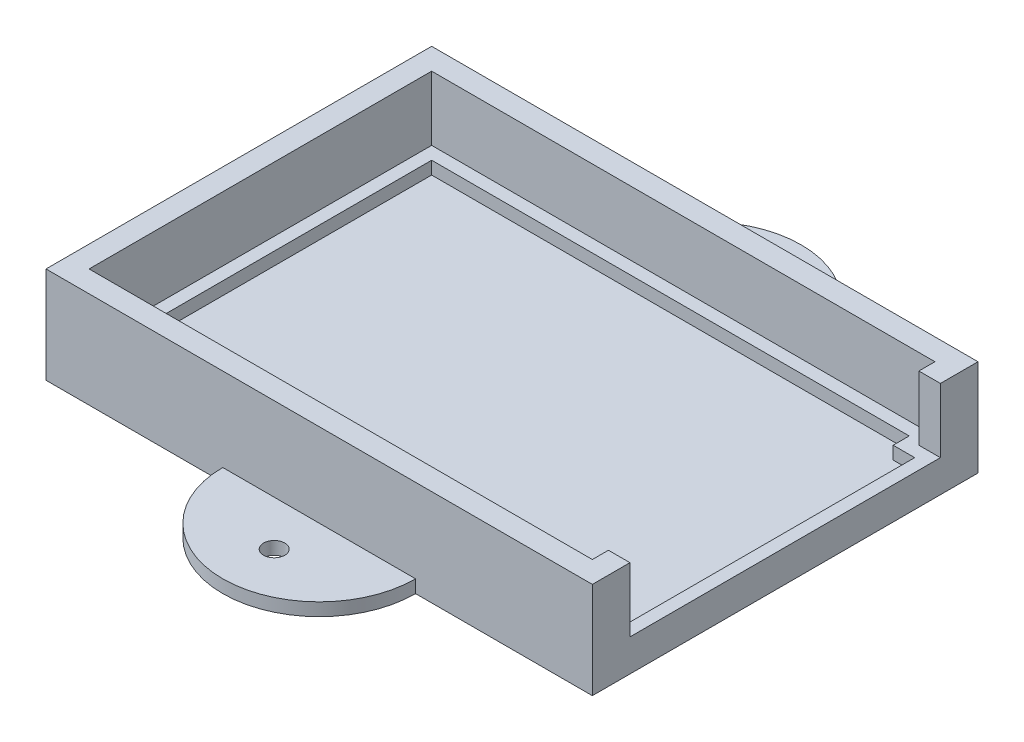
ISO-10303-21;
HEADER;
FILE_DESCRIPTION(('STEP AP214'),'2;1');
FILE_NAME('part.step','',(''),(''),'','','');
FILE_SCHEMA(('AUTOMOTIVE_DESIGN { 1 0 10303 214 1 1 1 1 }'));
ENDSEC;
DATA;
#1=APPLICATION_CONTEXT('core data for automotive mechanical design processes');
#2=APPLICATION_PROTOCOL_DEFINITION('international standard','automotive_design',2000,#1);
#3=PRODUCT_CONTEXT('',#1,'mechanical');
#4=PRODUCT('Part','Part','',(#3));
#5=PRODUCT_RELATED_PRODUCT_CATEGORY('part','',(#4));
#6=PRODUCT_DEFINITION_FORMATION('','',#4);
#7=PRODUCT_DEFINITION_CONTEXT('part definition',#1,'design');
#8=PRODUCT_DEFINITION('design','',#6,#7);
#9=PRODUCT_DEFINITION_SHAPE('','',#8);
#10=(LENGTH_UNIT() NAMED_UNIT(*) SI_UNIT(.MILLI.,.METRE.));
#11=(NAMED_UNIT(*) PLANE_ANGLE_UNIT() SI_UNIT($,.RADIAN.));
#12=(NAMED_UNIT(*) SI_UNIT($,.STERADIAN.) SOLID_ANGLE_UNIT());
#13=UNCERTAINTY_MEASURE_WITH_UNIT(LENGTH_MEASURE(1.E-05),#10,'distance_accuracy_value','');
#14=(GEOMETRIC_REPRESENTATION_CONTEXT(3) GLOBAL_UNCERTAINTY_ASSIGNED_CONTEXT((#13)) GLOBAL_UNIT_ASSIGNED_CONTEXT((#10,
#11,#12)) REPRESENTATION_CONTEXT('',''));
#15=CARTESIAN_POINT('',(0.,0.,0.));
#16=DIRECTION('',(0.,0.,1.));
#17=DIRECTION('',(1.,0.,0.));
#18=AXIS2_PLACEMENT_3D('',#15,#16,#17);
#19=CARTESIAN_POINT('',(39.15,15.,26.65));
#20=DIRECTION('',(-1.,0.,0.));
#21=DIRECTION('',(0.,0.,1.));
#22=AXIS2_PLACEMENT_3D('',#19,#20,#21);
#23=PLANE('',#22);
#24=DIRECTION('',(0.,0.,-1.));
#25=VECTOR('',#24,1.);
#26=CARTESIAN_POINT('',(39.15,5.,-24.15));
#27=LINE('',#26,#25);
#28=CARTESIAN_POINT('',(39.15,5.,-24.15));
#29=VERTEX_POINT('',#28);
#30=CARTESIAN_POINT('',(39.15,5.,-26.65));
#31=VERTEX_POINT('',#30);
#32=EDGE_CURVE('E304',#29,#31,#27,.T.);
#33=ORIENTED_EDGE('',*,*,#32,.F.);
#34=DIRECTION('',(0.,1.,0.));
#35=VECTOR('',#34,1.);
#36=CARTESIAN_POINT('',(39.15,-45.4160355667417,-24.15));
#37=LINE('',#36,#35);
#38=CARTESIAN_POINT('',(39.15,15.,-24.15));
#39=VERTEX_POINT('',#38);
#40=EDGE_CURVE('E317',#29,#39,#37,.T.);
#41=ORIENTED_EDGE('',*,*,#40,.T.);
#42=DIRECTION('',(0.,0.,-1.));
#43=VECTOR('',#42,1.);
#44=CARTESIAN_POINT('',(39.15,15.,26.65));
#45=LINE('',#44,#43);
#46=CARTESIAN_POINT('',(39.15,15.,-26.65));
#47=VERTEX_POINT('',#46);
#48=EDGE_CURVE('E319',#39,#47,#45,.T.);
#49=ORIENTED_EDGE('',*,*,#48,.T.);
#50=DIRECTION('',(0.,-1.,0.));
#51=VECTOR('',#50,1.);
#52=CARTESIAN_POINT('',(39.15,15.,-26.65));
#53=LINE('',#52,#51);
#54=EDGE_CURVE('E344',#47,#31,#53,.T.);
#55=ORIENTED_EDGE('',*,*,#54,.T.);
#56=EDGE_LOOP('',(#33,#41,#49,#55));
#57=FACE_BOUND('',#56,.T.);
#58=ADVANCED_FACE('F39',(#57),#23,.T.);
#59=CARTESIAN_POINT('',(-42.5,15.,30.));
#60=DIRECTION('',(1.,0.,0.));
#61=DIRECTION('',(0.,0.,-1.));
#62=AXIS2_PLACEMENT_3D('',#59,#60,#61);
#63=PLANE('',#62);
#64=DIRECTION('',(0.,0.,1.));
#65=VECTOR('',#64,1.);
#66=CARTESIAN_POINT('',(-42.5,0.,30.));
#67=LINE('',#66,#65);
#68=CARTESIAN_POINT('',(-42.5,0.,-30.));
#69=VERTEX_POINT('',#68);
#70=CARTESIAN_POINT('',(-42.5,0.,30.));
#71=VERTEX_POINT('',#70);
#72=EDGE_CURVE('E208',#69,#71,#67,.T.);
#73=ORIENTED_EDGE('',*,*,#72,.T.);
#74=DIRECTION('',(0.,-1.,0.));
#75=VECTOR('',#74,1.);
#76=CARTESIAN_POINT('',(-42.5,15.,30.));
#77=LINE('',#76,#75);
#78=CARTESIAN_POINT('',(-42.5,15.,30.));
#79=VERTEX_POINT('',#78);
#80=EDGE_CURVE('E47',#79,#71,#77,.T.);
#81=ORIENTED_EDGE('',*,*,#80,.F.);
#82=DIRECTION('',(0.,0.,1.));
#83=VECTOR('',#82,1.);
#84=CARTESIAN_POINT('',(-42.5,15.,30.));
#85=LINE('',#84,#83);
#86=CARTESIAN_POINT('',(-42.5,15.,-30.));
#87=VERTEX_POINT('',#86);
#88=EDGE_CURVE('E347',#87,#79,#85,.T.);
#89=ORIENTED_EDGE('',*,*,#88,.F.);
#90=DIRECTION('',(0.,-1.,0.));
#91=VECTOR('',#90,1.);
#92=CARTESIAN_POINT('',(-42.5,15.,-30.));
#93=LINE('',#92,#91);
#94=EDGE_CURVE('E359',#87,#69,#93,.T.);
#95=ORIENTED_EDGE('',*,*,#94,.T.);
#96=EDGE_LOOP('',(#73,#81,#89,#95));
#97=FACE_BOUND('',#96,.T.);
#98=ADVANCED_FACE('F41',(#97),#63,.F.);
#99=CARTESIAN_POINT('',(42.5,15.,30.));
#100=DIRECTION('',(0.,0.,-1.));
#101=DIRECTION('',(-1.,0.,0.));
#102=AXIS2_PLACEMENT_3D('',#99,#100,#101);
#103=PLANE('',#102);
#104=DIRECTION('',(1.,0.,0.));
#105=VECTOR('',#104,1.);
#106=CARTESIAN_POINT('',(42.5,0.,30.));
#107=LINE('',#106,#105);
#108=CARTESIAN_POINT('',(-15.,0.,30.));
#109=VERTEX_POINT('',#108);
#110=EDGE_CURVE('E207',#71,#109,#107,.T.);
#111=ORIENTED_EDGE('',*,*,#110,.T.);
#112=DIRECTION('',(0.,-1.,0.));
#113=VECTOR('',#112,1.);
#114=CARTESIAN_POINT('',(-15.,2.,30.));
#115=LINE('',#114,#113);
#116=CARTESIAN_POINT('',(-15.,2.,30.));
#117=VERTEX_POINT('',#116);
#118=EDGE_CURVE('E54',#117,#109,#115,.T.);
#119=ORIENTED_EDGE('',*,*,#118,.F.);
#120=DIRECTION('',(-1.,0.,0.));
#121=VECTOR('',#120,1.);
#122=CARTESIAN_POINT('',(42.5,2.,30.));
#123=LINE('',#122,#121);
#124=CARTESIAN_POINT('',(15.,2.,30.));
#125=VERTEX_POINT('',#124);
#126=EDGE_CURVE('E58',#125,#117,#123,.T.);
#127=ORIENTED_EDGE('',*,*,#126,.F.);
#128=DIRECTION('',(0.,-1.,0.));
#129=VECTOR('',#128,1.);
#130=CARTESIAN_POINT('',(15.,2.,30.));
#131=LINE('',#130,#129);
#132=CARTESIAN_POINT('',(15.,0.,30.));
#133=VERTEX_POINT('',#132);
#134=EDGE_CURVE('E210',#125,#133,#131,.T.);
#135=ORIENTED_EDGE('',*,*,#134,.T.);
#136=CARTESIAN_POINT('',(42.5,0.,30.));
#137=VERTEX_POINT('',#136);
#138=EDGE_CURVE('E199',#133,#137,#107,.T.);
#139=ORIENTED_EDGE('',*,*,#138,.T.);
#140=DIRECTION('',(0.,-1.,0.));
#141=VECTOR('',#140,1.);
#142=CARTESIAN_POINT('',(42.5,15.,30.));
#143=LINE('',#142,#141);
#144=CARTESIAN_POINT('',(42.5,15.,30.));
#145=VERTEX_POINT('',#144);
#146=EDGE_CURVE('E370',#145,#137,#143,.T.);
#147=ORIENTED_EDGE('',*,*,#146,.F.);
#148=DIRECTION('',(1.,0.,0.));
#149=VECTOR('',#148,1.);
#150=CARTESIAN_POINT('',(42.5,15.,30.));
#151=LINE('',#150,#149);
#152=EDGE_CURVE('E350',#79,#145,#151,.T.);
#153=ORIENTED_EDGE('',*,*,#152,.F.);
#154=ORIENTED_EDGE('',*,*,#80,.T.);
#155=EDGE_LOOP('',(#111,#119,#127,#135,#139,#147,#153,#154));
#156=FACE_BOUND('',#155,.T.);
#157=ADVANCED_FACE('F211',(#156),#103,.F.);
#158=CARTESIAN_POINT('',(42.5,15.,30.));
#159=DIRECTION('',(-1.,0.,0.));
#160=DIRECTION('',(0.,0.,1.));
#161=AXIS2_PLACEMENT_3D('',#158,#159,#160);
#162=PLANE('',#161);
#163=DIRECTION('',(0.,1.,0.));
#164=VECTOR('',#163,1.);
#165=CARTESIAN_POINT('',(42.5,-45.4160355667417,-24.15));
#166=LINE('',#165,#164);
#167=CARTESIAN_POINT('',(42.5,5.,-24.15));
#168=VERTEX_POINT('',#167);
#169=CARTESIAN_POINT('',(42.5,15.,-24.15));
#170=VERTEX_POINT('',#169);
#171=EDGE_CURVE('E320',#168,#170,#166,.T.);
#172=ORIENTED_EDGE('',*,*,#171,.F.);
#173=DIRECTION('',(0.,0.,-1.));
#174=VECTOR('',#173,1.);
#175=CARTESIAN_POINT('',(42.5,5.,24.15));
#176=LINE('',#175,#174);
#177=CARTESIAN_POINT('',(42.5,5.,24.15));
#178=VERTEX_POINT('',#177);
#179=EDGE_CURVE('E300',#178,#168,#176,.T.);
#180=ORIENTED_EDGE('',*,*,#179,.F.);
#181=DIRECTION('',(0.,1.,0.));
#182=VECTOR('',#181,1.);
#183=CARTESIAN_POINT('',(42.5,-45.4160355667417,24.15));
#184=LINE('',#183,#182);
#185=CARTESIAN_POINT('',(42.5,15.,24.15));
#186=VERTEX_POINT('',#185);
#187=EDGE_CURVE('E322',#178,#186,#184,.T.);
#188=ORIENTED_EDGE('',*,*,#187,.T.);
#189=DIRECTION('',(0.,0.,-1.));
#190=VECTOR('',#189,1.);
#191=CARTESIAN_POINT('',(42.5,15.,30.));
#192=LINE('',#191,#190);
#193=EDGE_CURVE('E354',#145,#186,#192,.T.);
#194=ORIENTED_EDGE('',*,*,#193,.F.);
#195=ORIENTED_EDGE('',*,*,#146,.T.);
#196=DIRECTION('',(0.,0.,-1.));
#197=VECTOR('',#196,1.);
#198=CARTESIAN_POINT('',(42.5,0.,30.));
#199=LINE('',#198,#197);
#200=CARTESIAN_POINT('',(42.5,0.,-30.));
#201=VERTEX_POINT('',#200);
#202=EDGE_CURVE('E204',#137,#201,#199,.T.);
#203=ORIENTED_EDGE('',*,*,#202,.T.);
#204=DIRECTION('',(0.,-1.,0.));
#205=VECTOR('',#204,1.);
#206=CARTESIAN_POINT('',(42.5,15.,-30.));
#207=LINE('',#206,#205);
#208=CARTESIAN_POINT('',(42.5,15.,-30.));
#209=VERTEX_POINT('',#208);
#210=EDGE_CURVE('E367',#209,#201,#207,.T.);
#211=ORIENTED_EDGE('',*,*,#210,.F.);
#212=EDGE_CURVE('E353',#170,#209,#192,.T.);
#213=ORIENTED_EDGE('',*,*,#212,.F.);
#214=EDGE_LOOP('',(#172,#180,#188,#194,#195,#203,#211,#213));
#215=FACE_BOUND('',#214,.T.);
#216=ADVANCED_FACE('F455',(#215),#162,.F.);
#217=CARTESIAN_POINT('',(42.5,15.,-30.));
#218=DIRECTION('',(0.,0.,1.));
#219=DIRECTION('',(1.,0.,0.));
#220=AXIS2_PLACEMENT_3D('',#217,#218,#219);
#221=PLANE('',#220);
#222=DIRECTION('',(1.,0.,0.));
#223=VECTOR('',#222,1.);
#224=CARTESIAN_POINT('',(42.5,2.,-30.));
#225=LINE('',#224,#223);
#226=CARTESIAN_POINT('',(-15.,2.,-30.));
#227=VERTEX_POINT('',#226);
#228=CARTESIAN_POINT('',(15.,2.,-30.));
#229=VERTEX_POINT('',#228);
#230=EDGE_CURVE('E11',#227,#229,#225,.T.);
#231=ORIENTED_EDGE('',*,*,#230,.F.);
#232=DIRECTION('',(0.,-1.,0.));
#233=VECTOR('',#232,1.);
#234=CARTESIAN_POINT('',(-15.,2.,-30.));
#235=LINE('',#234,#233);
#236=CARTESIAN_POINT('',(-15.,0.,-30.));
#237=VERTEX_POINT('',#236);
#238=EDGE_CURVE('E229',#227,#237,#235,.T.);
#239=ORIENTED_EDGE('',*,*,#238,.T.);
#240=DIRECTION('',(-1.,0.,0.));
#241=VECTOR('',#240,1.);
#242=CARTESIAN_POINT('',(42.5,0.,-30.));
#243=LINE('',#242,#241);
#244=EDGE_CURVE('E363',#237,#69,#243,.T.);
#245=ORIENTED_EDGE('',*,*,#244,.T.);
#246=ORIENTED_EDGE('',*,*,#94,.F.);
#247=DIRECTION('',(-1.,0.,0.));
#248=VECTOR('',#247,1.);
#249=CARTESIAN_POINT('',(42.5,15.,-30.));
#250=LINE('',#249,#248);
#251=EDGE_CURVE('E357',#209,#87,#250,.T.);
#252=ORIENTED_EDGE('',*,*,#251,.F.);
#253=ORIENTED_EDGE('',*,*,#210,.T.);
#254=CARTESIAN_POINT('',(15.,0.,-30.));
#255=VERTEX_POINT('',#254);
#256=EDGE_CURVE('E351',#201,#255,#243,.T.);
#257=ORIENTED_EDGE('',*,*,#256,.T.);
#258=DIRECTION('',(0.,-1.,0.));
#259=VECTOR('',#258,1.);
#260=CARTESIAN_POINT('',(15.,2.,-30.));
#261=LINE('',#260,#259);
#262=EDGE_CURVE('E215',#229,#255,#261,.T.);
#263=ORIENTED_EDGE('',*,*,#262,.F.);
#264=EDGE_LOOP('',(#231,#239,#245,#246,#252,#253,#257,#263));
#265=FACE_BOUND('',#264,.T.);
#266=ADVANCED_FACE('F380',(#265),#221,.F.);
#267=CARTESIAN_POINT('',(0.,15.,0.));
#268=DIRECTION('',(0.,1.,0.));
#269=DIRECTION('',(0.,0.,1.));
#270=AXIS2_PLACEMENT_3D('',#267,#268,#269);
#271=PLANE('',#270);
#272=DIRECTION('',(-1.,0.,0.));
#273=VECTOR('',#272,1.);
#274=CARTESIAN_POINT('',(39.15,15.,-24.15));
#275=LINE('',#274,#273);
#276=EDGE_CURVE('E313',#170,#39,#275,.T.);
#277=ORIENTED_EDGE('',*,*,#276,.F.);
#278=ORIENTED_EDGE('',*,*,#212,.T.);
#279=ORIENTED_EDGE('',*,*,#251,.T.);
#280=ORIENTED_EDGE('',*,*,#88,.T.);
#281=ORIENTED_EDGE('',*,*,#152,.T.);
#282=ORIENTED_EDGE('',*,*,#193,.T.);
#283=DIRECTION('',(1.,0.,0.));
#284=VECTOR('',#283,1.);
#285=CARTESIAN_POINT('',(39.15,15.,24.15));
#286=LINE('',#285,#284);
#287=CARTESIAN_POINT('',(39.15,15.,24.15));
#288=VERTEX_POINT('',#287);
#289=EDGE_CURVE('E310',#288,#186,#286,.T.);
#290=ORIENTED_EDGE('',*,*,#289,.F.);
#291=CARTESIAN_POINT('',(39.15,15.,26.65));
#292=VERTEX_POINT('',#291);
#293=EDGE_CURVE('E325',#292,#288,#45,.T.);
#294=ORIENTED_EDGE('',*,*,#293,.F.);
#295=DIRECTION('',(1.,0.,0.));
#296=VECTOR('',#295,1.);
#297=CARTESIAN_POINT('',(-39.15,15.,26.65));
#298=LINE('',#297,#296);
#299=CARTESIAN_POINT('',(-39.15,15.,26.65));
#300=VERTEX_POINT('',#299);
#301=EDGE_CURVE('E333',#300,#292,#298,.T.);
#302=ORIENTED_EDGE('',*,*,#301,.F.);
#303=DIRECTION('',(0.,0.,1.));
#304=VECTOR('',#303,1.);
#305=CARTESIAN_POINT('',(-39.15,15.,26.65));
#306=LINE('',#305,#304);
#307=CARTESIAN_POINT('',(-39.15,15.,-26.65));
#308=VERTEX_POINT('',#307);
#309=EDGE_CURVE('E330',#308,#300,#306,.T.);
#310=ORIENTED_EDGE('',*,*,#309,.F.);
#311=DIRECTION('',(-1.,0.,0.));
#312=VECTOR('',#311,1.);
#313=CARTESIAN_POINT('',(-39.15,15.,-26.65));
#314=LINE('',#313,#312);
#315=EDGE_CURVE('E328',#47,#308,#314,.T.);
#316=ORIENTED_EDGE('',*,*,#315,.F.);
#317=ORIENTED_EDGE('',*,*,#48,.F.);
#318=EDGE_LOOP('',(#277,#278,#279,#280,#281,#282,#290,#294,#302,#310,#316,#317));
#319=FACE_BOUND('',#318,.T.);
#320=ADVANCED_FACE('F424',(#319),#271,.T.);
#321=CARTESIAN_POINT('',(0.,0.,0.));
#322=DIRECTION('',(0.,1.,0.));
#323=DIRECTION('',(0.,0.,1.));
#324=AXIS2_PLACEMENT_3D('',#321,#322,#323);
#325=PLANE('',#324);
#326=CARTESIAN_POINT('',(0.,0.,-37.));
#327=DIRECTION('',(0.,1.,0.));
#328=DIRECTION('',(0.,0.,1.));
#329=AXIS2_PLACEMENT_3D('',#326,#327,#328);
#330=CIRCLE('',#329,1.65);
#331=CARTESIAN_POINT('',(0.,0.,-35.35));
#332=VERTEX_POINT('',#331);
#333=EDGE_CURVE('E225',#332,#332,#330,.T.);
#334=ORIENTED_EDGE('',*,*,#333,.T.);
#335=EDGE_LOOP('',(#334));
#336=FACE_BOUND('',#335,.T.);
#337=CARTESIAN_POINT('',(0.,0.,37.));
#338=DIRECTION('',(0.,1.,0.));
#339=DIRECTION('',(0.,0.,1.));
#340=AXIS2_PLACEMENT_3D('',#337,#338,#339);
#341=CIRCLE('',#340,1.65);
#342=CARTESIAN_POINT('',(0.,0.,38.65));
#343=VERTEX_POINT('',#342);
#344=EDGE_CURVE('E525',#343,#343,#341,.T.);
#345=ORIENTED_EDGE('',*,*,#344,.T.);
#346=EDGE_LOOP('',(#345));
#347=FACE_BOUND('',#346,.T.);
#348=ORIENTED_EDGE('',*,*,#138,.F.);
#349=CARTESIAN_POINT('',(0.,0.,30.));
#350=DIRECTION('',(0.,-1.,0.));
#351=DIRECTION('',(0.,0.,-1.));
#352=AXIS2_PLACEMENT_3D('',#349,#350,#351);
#353=CIRCLE('',#352,15.);
#354=EDGE_CURVE('E202',#133,#109,#353,.T.);
#355=ORIENTED_EDGE('',*,*,#354,.T.);
#356=ORIENTED_EDGE('',*,*,#110,.F.);
#357=ORIENTED_EDGE('',*,*,#72,.F.);
#358=ORIENTED_EDGE('',*,*,#244,.F.);
#359=CARTESIAN_POINT('',(0.,0.,-30.));
#360=DIRECTION('',(0.,-1.,0.));
#361=DIRECTION('',(0.,0.,-1.));
#362=AXIS2_PLACEMENT_3D('',#359,#360,#361);
#363=CIRCLE('',#362,15.);
#364=EDGE_CURVE('E219',#237,#255,#363,.T.);
#365=ORIENTED_EDGE('',*,*,#364,.T.);
#366=ORIENTED_EDGE('',*,*,#256,.F.);
#367=ORIENTED_EDGE('',*,*,#202,.F.);
#368=EDGE_LOOP('',(#348,#355,#356,#357,#358,#365,#366,#367));
#369=FACE_BOUND('',#368,.T.);
#370=ADVANCED_FACE('F200',(#336,#347,#369),#325,.F.);
#371=DIRECTION('',(0.,0.,-1.));
#372=VECTOR('',#371,1.);
#373=CARTESIAN_POINT('',(39.15,5.,26.65));
#374=LINE('',#373,#372);
#375=CARTESIAN_POINT('',(39.15,5.,26.65));
#376=VERTEX_POINT('',#375);
#377=CARTESIAN_POINT('',(39.15,5.,24.15));
#378=VERTEX_POINT('',#377);
#379=EDGE_CURVE('E295',#376,#378,#374,.T.);
#380=ORIENTED_EDGE('',*,*,#379,.F.);
#381=DIRECTION('',(0.,-1.,0.));
#382=VECTOR('',#381,1.);
#383=CARTESIAN_POINT('',(39.15,15.,26.65));
#384=LINE('',#383,#382);
#385=EDGE_CURVE('E335',#292,#376,#384,.T.);
#386=ORIENTED_EDGE('',*,*,#385,.F.);
#387=ORIENTED_EDGE('',*,*,#293,.T.);
#388=DIRECTION('',(0.,1.,0.));
#389=VECTOR('',#388,1.);
#390=CARTESIAN_POINT('',(39.15,-45.4160355667417,24.15));
#391=LINE('',#390,#389);
#392=EDGE_CURVE('E316',#378,#288,#391,.T.);
#393=ORIENTED_EDGE('',*,*,#392,.F.);
#394=EDGE_LOOP('',(#380,#386,#387,#393));
#395=FACE_BOUND('',#394,.T.);
#396=ADVANCED_FACE('F408',(#395),#23,.T.);
#397=CARTESIAN_POINT('',(-39.15,15.,-26.65));
#398=DIRECTION('',(0.,0.,1.));
#399=DIRECTION('',(1.,0.,0.));
#400=AXIS2_PLACEMENT_3D('',#397,#398,#399);
#401=PLANE('',#400);
#402=DIRECTION('',(-1.,0.,0.));
#403=VECTOR('',#402,1.);
#404=CARTESIAN_POINT('',(39.15,5.,-26.65));
#405=LINE('',#404,#403);
#406=CARTESIAN_POINT('',(-39.15,5.,-26.65));
#407=VERTEX_POINT('',#406);
#408=EDGE_CURVE('E306',#31,#407,#405,.T.);
#409=ORIENTED_EDGE('',*,*,#408,.F.);
#410=ORIENTED_EDGE('',*,*,#54,.F.);
#411=ORIENTED_EDGE('',*,*,#315,.T.);
#412=DIRECTION('',(0.,-1.,0.));
#413=VECTOR('',#412,1.);
#414=CARTESIAN_POINT('',(-39.15,15.,-26.65));
#415=LINE('',#414,#413);
#416=EDGE_CURVE('E341',#308,#407,#415,.T.);
#417=ORIENTED_EDGE('',*,*,#416,.T.);
#418=EDGE_LOOP('',(#409,#410,#411,#417));
#419=FACE_BOUND('',#418,.T.);
#420=ADVANCED_FACE('F417',(#419),#401,.T.);
#421=CARTESIAN_POINT('',(-39.15,15.,26.65));
#422=DIRECTION('',(1.,0.,0.));
#423=DIRECTION('',(0.,0.,-1.));
#424=AXIS2_PLACEMENT_3D('',#421,#422,#423);
#425=PLANE('',#424);
#426=DIRECTION('',(0.,0.,1.));
#427=VECTOR('',#426,1.);
#428=CARTESIAN_POINT('',(-39.15,5.,-26.65));
#429=LINE('',#428,#427);
#430=CARTESIAN_POINT('',(-39.15,5.,26.65));
#431=VERTEX_POINT('',#430);
#432=EDGE_CURVE('E308',#407,#431,#429,.T.);
#433=ORIENTED_EDGE('',*,*,#432,.F.);
#434=ORIENTED_EDGE('',*,*,#416,.F.);
#435=ORIENTED_EDGE('',*,*,#309,.T.);
#436=DIRECTION('',(0.,-1.,0.));
#437=VECTOR('',#436,1.);
#438=CARTESIAN_POINT('',(-39.15,15.,26.65));
#439=LINE('',#438,#437);
#440=EDGE_CURVE('E338',#300,#431,#439,.T.);
#441=ORIENTED_EDGE('',*,*,#440,.T.);
#442=EDGE_LOOP('',(#433,#434,#435,#441));
#443=FACE_BOUND('',#442,.T.);
#444=ADVANCED_FACE('F422',(#443),#425,.T.);
#445=CARTESIAN_POINT('',(-39.15,15.,26.65));
#446=DIRECTION('',(0.,0.,-1.));
#447=DIRECTION('',(-1.,0.,0.));
#448=AXIS2_PLACEMENT_3D('',#445,#446,#447);
#449=PLANE('',#448);
#450=DIRECTION('',(1.,0.,0.));
#451=VECTOR('',#450,1.);
#452=CARTESIAN_POINT('',(-39.15,5.,26.65));
#453=LINE('',#452,#451);
#454=EDGE_CURVE('E293',#431,#376,#453,.T.);
#455=ORIENTED_EDGE('',*,*,#454,.F.);
#456=ORIENTED_EDGE('',*,*,#440,.F.);
#457=ORIENTED_EDGE('',*,*,#301,.T.);
#458=ORIENTED_EDGE('',*,*,#385,.T.);
#459=EDGE_LOOP('',(#455,#456,#457,#458));
#460=FACE_BOUND('',#459,.T.);
#461=ADVANCED_FACE('F435',(#460),#449,.T.);
#462=CARTESIAN_POINT('',(39.15,-45.4160355667417,-24.15));
#463=DIRECTION('',(0.,0.,-1.));
#464=DIRECTION('',(-1.,0.,0.));
#465=AXIS2_PLACEMENT_3D('',#462,#463,#464);
#466=PLANE('',#465);
#467=ORIENTED_EDGE('',*,*,#40,.F.);
#468=DIRECTION('',(-1.,0.,0.));
#469=VECTOR('',#468,1.);
#470=CARTESIAN_POINT('',(42.5,5.,-24.15));
#471=LINE('',#470,#469);
#472=EDGE_CURVE('E302',#168,#29,#471,.T.);
#473=ORIENTED_EDGE('',*,*,#472,.F.);
#474=ORIENTED_EDGE('',*,*,#171,.T.);
#475=ORIENTED_EDGE('',*,*,#276,.T.);
#476=EDGE_LOOP('',(#467,#473,#474,#475));
#477=FACE_BOUND('',#476,.T.);
#478=ADVANCED_FACE('F453',(#477),#466,.F.);
#479=CARTESIAN_POINT('',(39.15,-45.4160355667417,24.15));
#480=DIRECTION('',(0.,0.,1.));
#481=DIRECTION('',(1.,0.,0.));
#482=AXIS2_PLACEMENT_3D('',#479,#480,#481);
#483=PLANE('',#482);
#484=ORIENTED_EDGE('',*,*,#187,.F.);
#485=DIRECTION('',(1.,0.,0.));
#486=VECTOR('',#485,1.);
#487=CARTESIAN_POINT('',(39.15,5.,24.15));
#488=LINE('',#487,#486);
#489=EDGE_CURVE('E297',#378,#178,#488,.T.);
#490=ORIENTED_EDGE('',*,*,#489,.F.);
#491=ORIENTED_EDGE('',*,*,#392,.T.);
#492=ORIENTED_EDGE('',*,*,#289,.T.);
#493=EDGE_LOOP('',(#484,#490,#491,#492));
#494=FACE_BOUND('',#493,.T.);
#495=ADVANCED_FACE('F445',(#494),#483,.F.);
#496=CARTESIAN_POINT('',(0.,5.,0.));
#497=DIRECTION('',(0.,1.,0.));
#498=DIRECTION('',(0.,0.,1.));
#499=AXIS2_PLACEMENT_3D('',#496,#497,#498);
#500=PLANE('',#499);
#501=ORIENTED_EDGE('',*,*,#454,.T.);
#502=ORIENTED_EDGE('',*,*,#379,.T.);
#503=ORIENTED_EDGE('',*,*,#489,.T.);
#504=ORIENTED_EDGE('',*,*,#179,.T.);
#505=ORIENTED_EDGE('',*,*,#472,.T.);
#506=ORIENTED_EDGE('',*,*,#32,.T.);
#507=ORIENTED_EDGE('',*,*,#408,.T.);
#508=ORIENTED_EDGE('',*,*,#432,.T.);
#509=EDGE_LOOP('',(#501,#502,#503,#504,#505,#506,#507,#508));
#510=FACE_BOUND('',#509,.T.);
#511=DIRECTION('',(0.,0.,-1.));
#512=VECTOR('',#511,1.);
#513=CARTESIAN_POINT('',(37.15,5.,24.65));
#514=LINE('',#513,#512);
#515=CARTESIAN_POINT('',(37.15,5.,24.65));
#516=VERTEX_POINT('',#515);
#517=CARTESIAN_POINT('',(37.15,5.,22.15));
#518=VERTEX_POINT('',#517);
#519=EDGE_CURVE('E239',#516,#518,#514,.T.);
#520=ORIENTED_EDGE('',*,*,#519,.F.);
#521=DIRECTION('',(1.,0.,0.));
#522=VECTOR('',#521,1.);
#523=CARTESIAN_POINT('',(-37.15,5.,24.65));
#524=LINE('',#523,#522);
#525=CARTESIAN_POINT('',(-37.15,5.,24.65));
#526=VERTEX_POINT('',#525);
#527=EDGE_CURVE('E237',#526,#516,#524,.T.);
#528=ORIENTED_EDGE('',*,*,#527,.F.);
#529=DIRECTION('',(0.,0.,1.));
#530=VECTOR('',#529,1.);
#531=CARTESIAN_POINT('',(-37.15,5.,-24.65));
#532=LINE('',#531,#530);
#533=CARTESIAN_POINT('',(-37.15,5.,-24.65));
#534=VERTEX_POINT('',#533);
#535=EDGE_CURVE('E253',#534,#526,#532,.T.);
#536=ORIENTED_EDGE('',*,*,#535,.F.);
#537=DIRECTION('',(-1.,0.,0.));
#538=VECTOR('',#537,1.);
#539=CARTESIAN_POINT('',(37.15,5.,-24.65));
#540=LINE('',#539,#538);
#541=CARTESIAN_POINT('',(37.15,5.,-24.65));
#542=VERTEX_POINT('',#541);
#543=EDGE_CURVE('E250',#542,#534,#540,.T.);
#544=ORIENTED_EDGE('',*,*,#543,.F.);
#545=DIRECTION('',(0.,0.,-1.));
#546=VECTOR('',#545,1.);
#547=CARTESIAN_POINT('',(37.15,5.,-22.15));
#548=LINE('',#547,#546);
#549=CARTESIAN_POINT('',(37.15,5.,-22.15));
#550=VERTEX_POINT('',#549);
#551=EDGE_CURVE('E248',#550,#542,#548,.T.);
#552=ORIENTED_EDGE('',*,*,#551,.F.);
#553=DIRECTION('',(-1.,0.,0.));
#554=VECTOR('',#553,1.);
#555=CARTESIAN_POINT('',(40.5,5.,-22.15));
#556=LINE('',#555,#554);
#557=CARTESIAN_POINT('',(40.5,5.,-22.15));
#558=VERTEX_POINT('',#557);
#559=EDGE_CURVE('E246',#558,#550,#556,.T.);
#560=ORIENTED_EDGE('',*,*,#559,.F.);
#561=DIRECTION('',(0.,0.,-1.));
#562=VECTOR('',#561,1.);
#563=CARTESIAN_POINT('',(40.5,5.,22.15));
#564=LINE('',#563,#562);
#565=CARTESIAN_POINT('',(40.5,5.,22.15));
#566=VERTEX_POINT('',#565);
#567=EDGE_CURVE('E244',#566,#558,#564,.T.);
#568=ORIENTED_EDGE('',*,*,#567,.F.);
#569=DIRECTION('',(1.,0.,0.));
#570=VECTOR('',#569,1.);
#571=CARTESIAN_POINT('',(37.15,5.,22.15));
#572=LINE('',#571,#570);
#573=EDGE_CURVE('E242',#518,#566,#572,.T.);
#574=ORIENTED_EDGE('',*,*,#573,.F.);
#575=EDGE_LOOP('',(#520,#528,#536,#544,#552,#560,#568,#574));
#576=FACE_BOUND('',#575,.T.);
#577=ADVANCED_FACE('F446',(#510,#576),#500,.T.);
#578=CARTESIAN_POINT('',(-37.15,5.,24.65));
#579=DIRECTION('',(0.,0.,-1.));
#580=DIRECTION('',(-1.,0.,0.));
#581=AXIS2_PLACEMENT_3D('',#578,#579,#580);
#582=PLANE('',#581);
#583=DIRECTION('',(1.,0.,0.));
#584=VECTOR('',#583,1.);
#585=CARTESIAN_POINT('',(-37.15,3.,24.65));
#586=LINE('',#585,#584);
#587=CARTESIAN_POINT('',(-37.15,3.,24.65));
#588=VERTEX_POINT('',#587);
#589=CARTESIAN_POINT('',(37.15,3.,24.65));
#590=VERTEX_POINT('',#589);
#591=EDGE_CURVE('E236',#588,#590,#586,.T.);
#592=ORIENTED_EDGE('',*,*,#591,.F.);
#593=DIRECTION('',(0.,-1.,0.));
#594=VECTOR('',#593,1.);
#595=CARTESIAN_POINT('',(-37.15,5.,24.65));
#596=LINE('',#595,#594);
#597=EDGE_CURVE('E255',#526,#588,#596,.T.);
#598=ORIENTED_EDGE('',*,*,#597,.F.);
#599=ORIENTED_EDGE('',*,*,#527,.T.);
#600=DIRECTION('',(0.,-1.,0.));
#601=VECTOR('',#600,1.);
#602=CARTESIAN_POINT('',(37.15,5.,24.65));
#603=LINE('',#602,#601);
#604=EDGE_CURVE('E290',#516,#590,#603,.T.);
#605=ORIENTED_EDGE('',*,*,#604,.T.);
#606=EDGE_LOOP('',(#592,#598,#599,#605));
#607=FACE_BOUND('',#606,.T.);
#608=ADVANCED_FACE('F477',(#607),#582,.T.);
#609=CARTESIAN_POINT('',(37.15,5.,24.65));
#610=DIRECTION('',(-1.,0.,0.));
#611=DIRECTION('',(0.,0.,1.));
#612=AXIS2_PLACEMENT_3D('',#609,#610,#611);
#613=PLANE('',#612);
#614=DIRECTION('',(0.,0.,-1.));
#615=VECTOR('',#614,1.);
#616=CARTESIAN_POINT('',(37.15,3.,24.65));
#617=LINE('',#616,#615);
#618=CARTESIAN_POINT('',(37.15,3.,22.15));
#619=VERTEX_POINT('',#618);
#620=EDGE_CURVE('E257',#590,#619,#617,.T.);
#621=ORIENTED_EDGE('',*,*,#620,.F.);
#622=ORIENTED_EDGE('',*,*,#604,.F.);
#623=ORIENTED_EDGE('',*,*,#519,.T.);
#624=DIRECTION('',(0.,-1.,0.));
#625=VECTOR('',#624,1.);
#626=CARTESIAN_POINT('',(37.15,5.,22.15));
#627=LINE('',#626,#625);
#628=EDGE_CURVE('E287',#518,#619,#627,.T.);
#629=ORIENTED_EDGE('',*,*,#628,.T.);
#630=EDGE_LOOP('',(#621,#622,#623,#629));
#631=FACE_BOUND('',#630,.T.);
#632=ADVANCED_FACE('F480',(#631),#613,.T.);
#633=CARTESIAN_POINT('',(37.15,5.,22.15));
#634=DIRECTION('',(0.,0.,-1.));
#635=DIRECTION('',(-1.,0.,0.));
#636=AXIS2_PLACEMENT_3D('',#633,#634,#635);
#637=PLANE('',#636);
#638=DIRECTION('',(1.,0.,0.));
#639=VECTOR('',#638,1.);
#640=CARTESIAN_POINT('',(37.15,3.,22.15));
#641=LINE('',#640,#639);
#642=CARTESIAN_POINT('',(40.5,3.,22.15));
#643=VERTEX_POINT('',#642);
#644=EDGE_CURVE('E259',#619,#643,#641,.T.);
#645=ORIENTED_EDGE('',*,*,#644,.F.);
#646=ORIENTED_EDGE('',*,*,#628,.F.);
#647=ORIENTED_EDGE('',*,*,#573,.T.);
#648=DIRECTION('',(0.,-1.,0.));
#649=VECTOR('',#648,1.);
#650=CARTESIAN_POINT('',(40.5,5.,22.15));
#651=LINE('',#650,#649);
#652=EDGE_CURVE('E284',#566,#643,#651,.T.);
#653=ORIENTED_EDGE('',*,*,#652,.T.);
#654=EDGE_LOOP('',(#645,#646,#647,#653));
#655=FACE_BOUND('',#654,.T.);
#656=ADVANCED_FACE('F484',(#655),#637,.T.);
#657=CARTESIAN_POINT('',(40.5,5.,22.15));
#658=DIRECTION('',(-1.,0.,0.));
#659=DIRECTION('',(0.,0.,1.));
#660=AXIS2_PLACEMENT_3D('',#657,#658,#659);
#661=PLANE('',#660);
#662=DIRECTION('',(0.,0.,-1.));
#663=VECTOR('',#662,1.);
#664=CARTESIAN_POINT('',(40.5,3.,22.15));
#665=LINE('',#664,#663);
#666=CARTESIAN_POINT('',(40.5,3.,-22.15));
#667=VERTEX_POINT('',#666);
#668=EDGE_CURVE('E261',#643,#667,#665,.T.);
#669=ORIENTED_EDGE('',*,*,#668,.F.);
#670=ORIENTED_EDGE('',*,*,#652,.F.);
#671=ORIENTED_EDGE('',*,*,#567,.T.);
#672=DIRECTION('',(0.,-1.,0.));
#673=VECTOR('',#672,1.);
#674=CARTESIAN_POINT('',(40.5,5.,-22.15));
#675=LINE('',#674,#673);
#676=EDGE_CURVE('E281',#558,#667,#675,.T.);
#677=ORIENTED_EDGE('',*,*,#676,.T.);
#678=EDGE_LOOP('',(#669,#670,#671,#677));
#679=FACE_BOUND('',#678,.T.);
#680=ADVANCED_FACE('F488',(#679),#661,.T.);
#681=CARTESIAN_POINT('',(40.5,5.,-22.15));
#682=DIRECTION('',(0.,0.,1.));
#683=DIRECTION('',(1.,0.,0.));
#684=AXIS2_PLACEMENT_3D('',#681,#682,#683);
#685=PLANE('',#684);
#686=DIRECTION('',(-1.,0.,0.));
#687=VECTOR('',#686,1.);
#688=CARTESIAN_POINT('',(40.5,3.,-22.15));
#689=LINE('',#688,#687);
#690=CARTESIAN_POINT('',(37.15,3.,-22.15));
#691=VERTEX_POINT('',#690);
#692=EDGE_CURVE('E263',#667,#691,#689,.T.);
#693=ORIENTED_EDGE('',*,*,#692,.F.);
#694=ORIENTED_EDGE('',*,*,#676,.F.);
#695=ORIENTED_EDGE('',*,*,#559,.T.);
#696=DIRECTION('',(0.,-1.,0.));
#697=VECTOR('',#696,1.);
#698=CARTESIAN_POINT('',(37.15,5.,-22.15));
#699=LINE('',#698,#697);
#700=EDGE_CURVE('E278',#550,#691,#699,.T.);
#701=ORIENTED_EDGE('',*,*,#700,.T.);
#702=EDGE_LOOP('',(#693,#694,#695,#701));
#703=FACE_BOUND('',#702,.T.);
#704=ADVANCED_FACE('F492',(#703),#685,.T.);
#705=CARTESIAN_POINT('',(37.15,5.,-22.15));
#706=DIRECTION('',(-1.,0.,0.));
#707=DIRECTION('',(0.,0.,1.));
#708=AXIS2_PLACEMENT_3D('',#705,#706,#707);
#709=PLANE('',#708);
#710=DIRECTION('',(0.,0.,-1.));
#711=VECTOR('',#710,1.);
#712=CARTESIAN_POINT('',(37.15,3.,-22.15));
#713=LINE('',#712,#711);
#714=CARTESIAN_POINT('',(37.15,3.,-24.65));
#715=VERTEX_POINT('',#714);
#716=EDGE_CURVE('E265',#691,#715,#713,.T.);
#717=ORIENTED_EDGE('',*,*,#716,.F.);
#718=ORIENTED_EDGE('',*,*,#700,.F.);
#719=ORIENTED_EDGE('',*,*,#551,.T.);
#720=DIRECTION('',(0.,-1.,0.));
#721=VECTOR('',#720,1.);
#722=CARTESIAN_POINT('',(37.15,5.,-24.65));
#723=LINE('',#722,#721);
#724=EDGE_CURVE('E275',#542,#715,#723,.T.);
#725=ORIENTED_EDGE('',*,*,#724,.T.);
#726=EDGE_LOOP('',(#717,#718,#719,#725));
#727=FACE_BOUND('',#726,.T.);
#728=ADVANCED_FACE('F496',(#727),#709,.T.);
#729=CARTESIAN_POINT('',(37.15,5.,-24.65));
#730=DIRECTION('',(0.,0.,1.));
#731=DIRECTION('',(1.,0.,0.));
#732=AXIS2_PLACEMENT_3D('',#729,#730,#731);
#733=PLANE('',#732);
#734=DIRECTION('',(-1.,0.,0.));
#735=VECTOR('',#734,1.);
#736=CARTESIAN_POINT('',(37.15,3.,-24.65));
#737=LINE('',#736,#735);
#738=CARTESIAN_POINT('',(-37.15,3.,-24.65));
#739=VERTEX_POINT('',#738);
#740=EDGE_CURVE('E267',#715,#739,#737,.T.);
#741=ORIENTED_EDGE('',*,*,#740,.F.);
#742=ORIENTED_EDGE('',*,*,#724,.F.);
#743=ORIENTED_EDGE('',*,*,#543,.T.);
#744=DIRECTION('',(0.,-1.,0.));
#745=VECTOR('',#744,1.);
#746=CARTESIAN_POINT('',(-37.15,5.,-24.65));
#747=LINE('',#746,#745);
#748=EDGE_CURVE('E272',#534,#739,#747,.T.);
#749=ORIENTED_EDGE('',*,*,#748,.T.);
#750=EDGE_LOOP('',(#741,#742,#743,#749));
#751=FACE_BOUND('',#750,.T.);
#752=ADVANCED_FACE('F500',(#751),#733,.T.);
#753=CARTESIAN_POINT('',(-37.15,5.,-24.65));
#754=DIRECTION('',(1.,0.,0.));
#755=DIRECTION('',(0.,0.,-1.));
#756=AXIS2_PLACEMENT_3D('',#753,#754,#755);
#757=PLANE('',#756);
#758=DIRECTION('',(0.,0.,1.));
#759=VECTOR('',#758,1.);
#760=CARTESIAN_POINT('',(-37.15,3.,-24.65));
#761=LINE('',#760,#759);
#762=EDGE_CURVE('E240',#739,#588,#761,.T.);
#763=ORIENTED_EDGE('',*,*,#762,.F.);
#764=ORIENTED_EDGE('',*,*,#748,.F.);
#765=ORIENTED_EDGE('',*,*,#535,.T.);
#766=ORIENTED_EDGE('',*,*,#597,.T.);
#767=EDGE_LOOP('',(#763,#764,#765,#766));
#768=FACE_BOUND('',#767,.T.);
#769=ADVANCED_FACE('F398',(#768),#757,.T.);
#770=CARTESIAN_POINT('',(0.,3.,0.));
#771=DIRECTION('',(0.,1.,0.));
#772=DIRECTION('',(0.,0.,1.));
#773=AXIS2_PLACEMENT_3D('',#770,#771,#772);
#774=PLANE('',#773);
#775=ORIENTED_EDGE('',*,*,#591,.T.);
#776=ORIENTED_EDGE('',*,*,#620,.T.);
#777=ORIENTED_EDGE('',*,*,#644,.T.);
#778=ORIENTED_EDGE('',*,*,#668,.T.);
#779=ORIENTED_EDGE('',*,*,#692,.T.);
#780=ORIENTED_EDGE('',*,*,#716,.T.);
#781=ORIENTED_EDGE('',*,*,#740,.T.);
#782=ORIENTED_EDGE('',*,*,#762,.T.);
#783=EDGE_LOOP('',(#775,#776,#777,#778,#779,#780,#781,#782));
#784=FACE_BOUND('',#783,.T.);
#785=ADVANCED_FACE('F387',(#784),#774,.T.);
#786=CARTESIAN_POINT('',(0.,2.,-30.));
#787=DIRECTION('',(0.,-1.,0.));
#788=DIRECTION('',(0.,0.,-1.));
#789=AXIS2_PLACEMENT_3D('',#786,#787,#788);
#790=PLANE('',#789);
#791=CARTESIAN_POINT('',(0.,2.,-37.));
#792=DIRECTION('',(0.,1.,0.));
#793=DIRECTION('',(0.,0.,1.));
#794=AXIS2_PLACEMENT_3D('',#791,#792,#793);
#795=CIRCLE('',#794,1.65);
#796=CARTESIAN_POINT('',(0.,2.,-35.35));
#797=VERTEX_POINT('',#796);
#798=EDGE_CURVE('E527',#797,#797,#795,.T.);
#799=ORIENTED_EDGE('',*,*,#798,.F.);
#800=EDGE_LOOP('',(#799));
#801=FACE_BOUND('',#800,.T.);
#802=CARTESIAN_POINT('',(0.,2.,-30.));
#803=DIRECTION('',(0.,-1.,0.));
#804=DIRECTION('',(0.,0.,-1.));
#805=AXIS2_PLACEMENT_3D('',#802,#803,#804);
#806=CIRCLE('',#805,15.);
#807=EDGE_CURVE('E218',#227,#229,#806,.T.);
#808=ORIENTED_EDGE('',*,*,#807,.F.);
#809=ORIENTED_EDGE('',*,*,#230,.T.);
#810=EDGE_LOOP('',(#808,#809));
#811=FACE_BOUND('',#810,.T.);
#812=ADVANCED_FACE('F385',(#801,#811),#790,.F.);
#813=CARTESIAN_POINT('',(0.,2.,-30.));
#814=DIRECTION('',(0.,-1.,0.));
#815=DIRECTION('',(0.,0.,-1.));
#816=AXIS2_PLACEMENT_3D('',#813,#814,#815);
#817=CYLINDRICAL_SURFACE('',#816,15.);
#818=ORIENTED_EDGE('',*,*,#364,.F.);
#819=ORIENTED_EDGE('',*,*,#238,.F.);
#820=ORIENTED_EDGE('',*,*,#807,.T.);
#821=ORIENTED_EDGE('',*,*,#262,.T.);
#822=EDGE_LOOP('',(#818,#819,#820,#821));
#823=FACE_BOUND('',#822,.T.);
#824=ADVANCED_FACE('F383',(#823),#817,.T.);
#825=CARTESIAN_POINT('',(0.,2.,37.));
#826=DIRECTION('',(0.,1.,0.));
#827=DIRECTION('',(0.,0.,1.));
#828=AXIS2_PLACEMENT_3D('',#825,#826,#827);
#829=CIRCLE('',#828,1.65);
#830=CARTESIAN_POINT('',(0.,2.,38.65));
#831=VERTEX_POINT('',#830);
#832=EDGE_CURVE('E522',#831,#831,#829,.T.);
#833=ORIENTED_EDGE('',*,*,#832,.F.);
#834=EDGE_LOOP('',(#833));
#835=FACE_BOUND('',#834,.T.);
#836=CARTESIAN_POINT('',(0.,2.,30.));
#837=DIRECTION('',(0.,-1.,0.));
#838=DIRECTION('',(0.,0.,-1.));
#839=AXIS2_PLACEMENT_3D('',#836,#837,#838);
#840=CIRCLE('',#839,15.);
#841=EDGE_CURVE('E222',#125,#117,#840,.T.);
#842=ORIENTED_EDGE('',*,*,#841,.F.);
#843=ORIENTED_EDGE('',*,*,#126,.T.);
#844=EDGE_LOOP('',(#842,#843));
#845=FACE_BOUND('',#844,.T.);
#846=ADVANCED_FACE('F390',(#835,#845),#790,.F.);
#847=CARTESIAN_POINT('',(0.,2.,30.));
#848=DIRECTION('',(0.,-1.,0.));
#849=DIRECTION('',(0.,0.,-1.));
#850=AXIS2_PLACEMENT_3D('',#847,#848,#849);
#851=CYLINDRICAL_SURFACE('',#850,15.);
#852=ORIENTED_EDGE('',*,*,#354,.F.);
#853=ORIENTED_EDGE('',*,*,#134,.F.);
#854=ORIENTED_EDGE('',*,*,#841,.T.);
#855=ORIENTED_EDGE('',*,*,#118,.T.);
#856=EDGE_LOOP('',(#852,#853,#854,#855));
#857=FACE_BOUND('',#856,.T.);
#858=ADVANCED_FACE('F217',(#857),#851,.T.);
#859=CARTESIAN_POINT('',(0.,-19.,37.));
#860=DIRECTION('',(0.,1.,0.));
#861=DIRECTION('',(0.,0.,1.));
#862=AXIS2_PLACEMENT_3D('',#859,#860,#861);
#863=CYLINDRICAL_SURFACE('',#862,1.65);
#864=ORIENTED_EDGE('',*,*,#832,.T.);
#865=EDGE_LOOP('',(#864));
#866=FACE_BOUND('',#865,.T.);
#867=ORIENTED_EDGE('',*,*,#344,.F.);
#868=EDGE_LOOP('',(#867));
#869=FACE_BOUND('',#868,.T.);
#870=ADVANCED_FACE('F508',(#866,#869),#863,.F.);
#871=CARTESIAN_POINT('',(0.,-19.,-37.));
#872=DIRECTION('',(0.,1.,0.));
#873=DIRECTION('',(0.,0.,1.));
#874=AXIS2_PLACEMENT_3D('',#871,#872,#873);
#875=CYLINDRICAL_SURFACE('',#874,1.65);
#876=ORIENTED_EDGE('',*,*,#798,.T.);
#877=EDGE_LOOP('',(#876));
#878=FACE_BOUND('',#877,.T.);
#879=ORIENTED_EDGE('',*,*,#333,.F.);
#880=EDGE_LOOP('',(#879));
#881=FACE_BOUND('',#880,.T.);
#882=ADVANCED_FACE('F512',(#878,#881),#875,.F.);
#883=CLOSED_SHELL('',(#58,#98,#157,#216,#266,#320,#370,#396,#420,#444,#461,#478,#495,#577,#608,
#632,#656,#680,#704,#728,#752,#769,#785,#812,#824,#846,#858,#870,#882));
#884=MANIFOLD_SOLID_BREP('B2',#883);
#885=ADVANCED_BREP_SHAPE_REPRESENTATION('',(#18,#884),#14);
#886=SHAPE_DEFINITION_REPRESENTATION(#9,#885);
ENDSEC;
END-ISO-10303-21;
